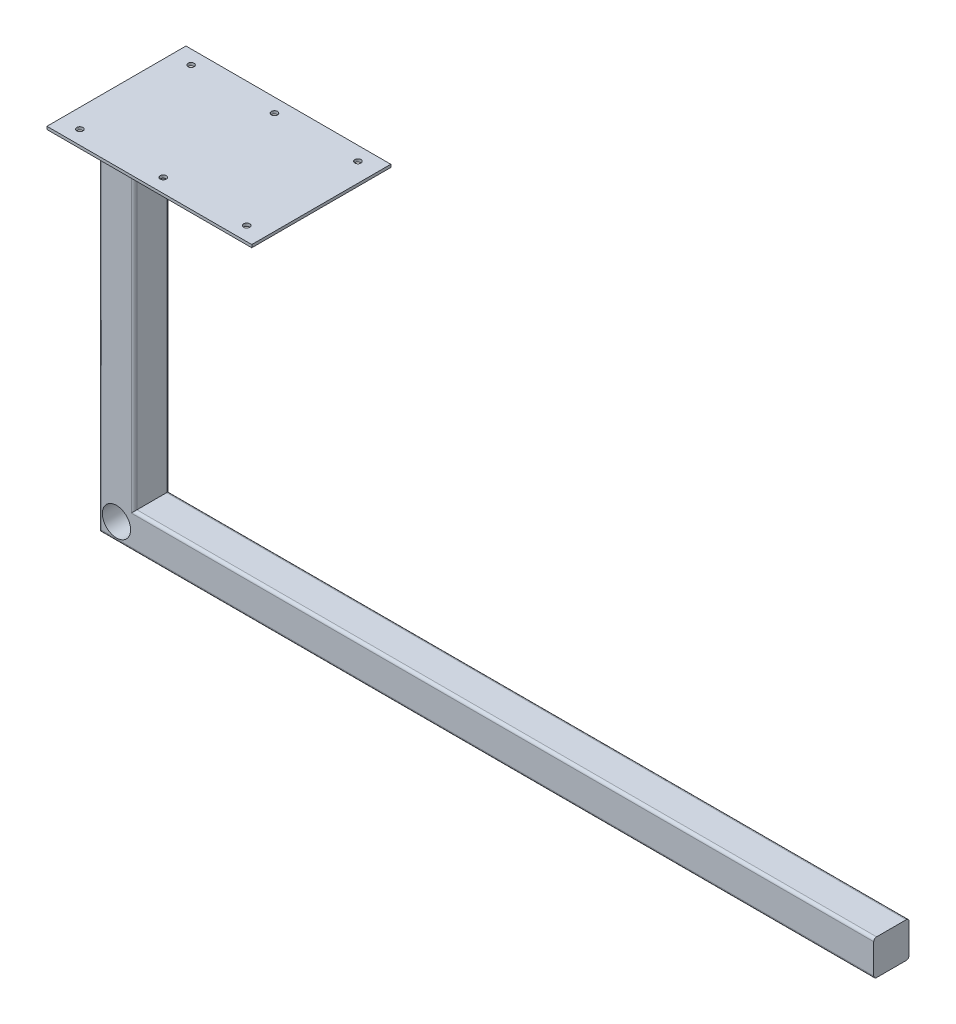
ISO-10303-21;
HEADER;
FILE_DESCRIPTION(('STEP AP214'),'2;1');
FILE_NAME('part.step','',(''),(''),'','','');
FILE_SCHEMA(('AUTOMOTIVE_DESIGN { 1 0 10303 214 1 1 1 1 }'));
ENDSEC;
DATA;
#1=APPLICATION_CONTEXT('core data for automotive mechanical design processes');
#2=APPLICATION_PROTOCOL_DEFINITION('international standard','automotive_design',2000,#1);
#3=PRODUCT_CONTEXT('',#1,'mechanical');
#4=PRODUCT('Part','Part','',(#3));
#5=PRODUCT_RELATED_PRODUCT_CATEGORY('part','',(#4));
#6=PRODUCT_DEFINITION_FORMATION('','',#4);
#7=PRODUCT_DEFINITION_CONTEXT('part definition',#1,'design');
#8=PRODUCT_DEFINITION('design','',#6,#7);
#9=PRODUCT_DEFINITION_SHAPE('','',#8);
#10=(LENGTH_UNIT() NAMED_UNIT(*) SI_UNIT(.MILLI.,.METRE.));
#11=(NAMED_UNIT(*) PLANE_ANGLE_UNIT() SI_UNIT($,.RADIAN.));
#12=(NAMED_UNIT(*) SI_UNIT($,.STERADIAN.) SOLID_ANGLE_UNIT());
#13=UNCERTAINTY_MEASURE_WITH_UNIT(LENGTH_MEASURE(1.E-05),#10,'distance_accuracy_value','');
#14=(GEOMETRIC_REPRESENTATION_CONTEXT(3) GLOBAL_UNCERTAINTY_ASSIGNED_CONTEXT((#13)) GLOBAL_UNIT_ASSIGNED_CONTEXT((#10,
#11,#12)) REPRESENTATION_CONTEXT('',''));
#15=CARTESIAN_POINT('',(0.,0.,0.));
#16=DIRECTION('',(0.,0.,1.));
#17=DIRECTION('',(1.,0.,0.));
#18=AXIS2_PLACEMENT_3D('',#15,#16,#17);
#19=CARTESIAN_POINT('',(0.,0.,31.75));
#20=DIRECTION('',(0.,0.,1.));
#21=DIRECTION('',(1.,0.,0.));
#22=AXIS2_PLACEMENT_3D('',#19,#20,#21);
#23=PLANE('',#22);
#24=DIRECTION('',(0.,-1.,0.));
#25=VECTOR('',#24,1.);
#26=CARTESIAN_POINT('',(2.54,0.,31.75));
#27=LINE('',#26,#25);
#28=CARTESIAN_POINT('',(2.54,336.55,31.75));
#29=VERTEX_POINT('',#28);
#30=CARTESIAN_POINT('',(2.54,2.54,31.75));
#31=VERTEX_POINT('',#30);
#32=EDGE_CURVE('E261',#29,#31,#27,.T.);
#33=ORIENTED_EDGE('',*,*,#32,.T.);
#34=DIRECTION('',(1.,0.,0.));
#35=VECTOR('',#34,1.);
#36=CARTESIAN_POINT('',(696.722,2.54,31.75));
#37=LINE('',#36,#35);
#38=CARTESIAN_POINT('',(696.722,2.54,31.75));
#39=VERTEX_POINT('',#38);
#40=EDGE_CURVE('E263',#31,#39,#37,.T.);
#41=ORIENTED_EDGE('',*,*,#40,.T.);
#42=DIRECTION('',(0.,-1.,0.));
#43=VECTOR('',#42,1.);
#44=CARTESIAN_POINT('',(696.722,31.75,31.75));
#45=LINE('',#44,#43);
#46=CARTESIAN_POINT('',(696.722,29.21,31.75));
#47=VERTEX_POINT('',#46);
#48=EDGE_CURVE('E215',#47,#39,#45,.T.);
#49=ORIENTED_EDGE('',*,*,#48,.F.);
#50=DIRECTION('',(1.,0.,0.));
#51=VECTOR('',#50,1.);
#52=CARTESIAN_POINT('',(0.,29.21,31.75));
#53=LINE('',#52,#51);
#54=CARTESIAN_POINT('',(29.21,29.21,31.75));
#55=VERTEX_POINT('',#54);
#56=EDGE_CURVE('E259',#47,#55,#53,.F.);
#57=ORIENTED_EDGE('',*,*,#56,.T.);
#58=DIRECTION('',(0.,-1.,0.));
#59=VECTOR('',#58,1.);
#60=CARTESIAN_POINT('',(29.21,0.,31.75));
#61=LINE('',#60,#59);
#62=CARTESIAN_POINT('',(29.21,336.55,31.75));
#63=VERTEX_POINT('',#62);
#64=EDGE_CURVE('E257',#55,#63,#61,.F.);
#65=ORIENTED_EDGE('',*,*,#64,.T.);
#66=DIRECTION('',(-1.,0.,0.));
#67=VECTOR('',#66,1.);
#68=CARTESIAN_POINT('',(31.75,336.55,31.75));
#69=LINE('',#68,#67);
#70=EDGE_CURVE('E213',#63,#29,#69,.T.);
#71=ORIENTED_EDGE('',*,*,#70,.T.);
#72=EDGE_LOOP('',(#33,#41,#49,#57,#65,#71));
#73=FACE_BOUND('',#72,.T.);
#74=CARTESIAN_POINT('',(15.8750000000001,15.875,31.75));
#75=DIRECTION('',(0.,0.,1.));
#76=DIRECTION('',(1.,0.,0.));
#77=AXIS2_PLACEMENT_3D('',#74,#75,#76);
#78=CIRCLE('',#77,12.7);
#79=CARTESIAN_POINT('',(28.5750000000001,15.875,31.75));
#80=VERTEX_POINT('',#79);
#81=EDGE_CURVE('E205',#80,#80,#78,.T.);
#82=ORIENTED_EDGE('',*,*,#81,.F.);
#83=EDGE_LOOP('',(#82));
#84=FACE_BOUND('',#83,.T.);
#85=ADVANCED_FACE('F60',(#73,#84),#23,.T.);
#86=CARTESIAN_POINT('',(0.,0.,0.));
#87=DIRECTION('',(0.,0.,1.));
#88=DIRECTION('',(1.,0.,0.));
#89=AXIS2_PLACEMENT_3D('',#86,#87,#88);
#90=PLANE('',#89);
#91=DIRECTION('',(0.,-1.,0.));
#92=VECTOR('',#91,1.);
#93=CARTESIAN_POINT('',(696.722,31.75,0.));
#94=LINE('',#93,#92);
#95=CARTESIAN_POINT('',(696.722,29.21,0.));
#96=VERTEX_POINT('',#95);
#97=CARTESIAN_POINT('',(696.722,2.54,0.));
#98=VERTEX_POINT('',#97);
#99=EDGE_CURVE('E216',#96,#98,#94,.T.);
#100=ORIENTED_EDGE('',*,*,#99,.T.);
#101=DIRECTION('',(1.,0.,0.));
#102=VECTOR('',#101,1.);
#103=CARTESIAN_POINT('',(0.,2.54,0.));
#104=LINE('',#103,#102);
#105=CARTESIAN_POINT('',(2.54,2.54,0.));
#106=VERTEX_POINT('',#105);
#107=EDGE_CURVE('E255',#98,#106,#104,.F.);
#108=ORIENTED_EDGE('',*,*,#107,.T.);
#109=DIRECTION('',(0.,-1.,0.));
#110=VECTOR('',#109,1.);
#111=CARTESIAN_POINT('',(2.54,0.,0.));
#112=LINE('',#111,#110);
#113=CARTESIAN_POINT('',(2.54,336.55,0.));
#114=VERTEX_POINT('',#113);
#115=EDGE_CURVE('E253',#106,#114,#112,.F.);
#116=ORIENTED_EDGE('',*,*,#115,.T.);
#117=DIRECTION('',(-1.,0.,0.));
#118=VECTOR('',#117,1.);
#119=CARTESIAN_POINT('',(31.75,336.55,0.));
#120=LINE('',#119,#118);
#121=CARTESIAN_POINT('',(29.21,336.55,0.));
#122=VERTEX_POINT('',#121);
#123=EDGE_CURVE('E208',#122,#114,#120,.T.);
#124=ORIENTED_EDGE('',*,*,#123,.F.);
#125=DIRECTION('',(0.,-1.,0.));
#126=VECTOR('',#125,1.);
#127=CARTESIAN_POINT('',(29.21,31.75,0.));
#128=LINE('',#127,#126);
#129=CARTESIAN_POINT('',(29.21,29.21,0.));
#130=VERTEX_POINT('',#129);
#131=EDGE_CURVE('E248',#122,#130,#128,.T.);
#132=ORIENTED_EDGE('',*,*,#131,.T.);
#133=DIRECTION('',(1.,0.,0.));
#134=VECTOR('',#133,1.);
#135=CARTESIAN_POINT('',(696.722,29.21,0.));
#136=LINE('',#135,#134);
#137=EDGE_CURVE('E250',#130,#96,#136,.T.);
#138=ORIENTED_EDGE('',*,*,#137,.T.);
#139=EDGE_LOOP('',(#100,#108,#116,#124,#132,#138));
#140=FACE_BOUND('',#139,.T.);
#141=CARTESIAN_POINT('',(15.8750000000001,15.875,0.));
#142=DIRECTION('',(0.,0.,1.));
#143=DIRECTION('',(1.,0.,0.));
#144=AXIS2_PLACEMENT_3D('',#141,#142,#143);
#145=CIRCLE('',#144,12.7);
#146=CARTESIAN_POINT('',(28.5750000000001,15.875,0.));
#147=VERTEX_POINT('',#146);
#148=EDGE_CURVE('E209',#147,#147,#145,.T.);
#149=ORIENTED_EDGE('',*,*,#148,.T.);
#150=EDGE_LOOP('',(#149));
#151=FACE_BOUND('',#150,.T.);
#152=ADVANCED_FACE('F324',(#140,#151),#90,.F.);
#153=CARTESIAN_POINT('',(0.,336.55,31.75));
#154=DIRECTION('',(1.,0.,0.));
#155=DIRECTION('',(0.,0.,-1.));
#156=AXIS2_PLACEMENT_3D('',#153,#154,#155);
#157=PLANE('',#156);
#158=DIRECTION('',(0.,-1.,0.));
#159=VECTOR('',#158,1.);
#160=CARTESIAN_POINT('',(0.,336.55,29.21));
#161=LINE('',#160,#159);
#162=CARTESIAN_POINT('',(0.,0.,29.21));
#163=VERTEX_POINT('',#162);
#164=CARTESIAN_POINT('',(0.,336.55,29.21));
#165=VERTEX_POINT('',#164);
#166=EDGE_CURVE('E271',#163,#165,#161,.F.);
#167=ORIENTED_EDGE('',*,*,#166,.T.);
#168=DIRECTION('',(0.,0.,1.));
#169=VECTOR('',#168,1.);
#170=CARTESIAN_POINT('',(0.,336.55,-46.625));
#171=LINE('',#170,#169);
#172=CARTESIAN_POINT('',(0.,336.55,78.375));
#173=VERTEX_POINT('',#172);
#174=EDGE_CURVE('E196',#165,#173,#171,.T.);
#175=ORIENTED_EDGE('',*,*,#174,.T.);
#176=DIRECTION('',(0.,-1.,0.));
#177=VECTOR('',#176,1.);
#178=CARTESIAN_POINT('',(0.,339.09,78.375));
#179=LINE('',#178,#177);
#180=CARTESIAN_POINT('',(0.,339.09,78.375));
#181=VERTEX_POINT('',#180);
#182=EDGE_CURVE('E177',#181,#173,#179,.T.);
#183=ORIENTED_EDGE('',*,*,#182,.F.);
#184=DIRECTION('',(0.,0.,1.));
#185=VECTOR('',#184,1.);
#186=CARTESIAN_POINT('',(0.,339.09,-46.625));
#187=LINE('',#186,#185);
#188=CARTESIAN_POINT('',(0.,339.09,-46.625));
#189=VERTEX_POINT('',#188);
#190=EDGE_CURVE('E183',#189,#181,#187,.T.);
#191=ORIENTED_EDGE('',*,*,#190,.F.);
#192=DIRECTION('',(0.,-1.,0.));
#193=VECTOR('',#192,1.);
#194=CARTESIAN_POINT('',(0.,339.09,-46.625));
#195=LINE('',#194,#193);
#196=CARTESIAN_POINT('',(0.,336.55,-46.625));
#197=VERTEX_POINT('',#196);
#198=EDGE_CURVE('E695',#189,#197,#195,.T.);
#199=ORIENTED_EDGE('',*,*,#198,.T.);
#200=CARTESIAN_POINT('',(0.,336.55,2.54));
#201=VERTEX_POINT('',#200);
#202=EDGE_CURVE('E696',#197,#201,#171,.T.);
#203=ORIENTED_EDGE('',*,*,#202,.T.);
#204=DIRECTION('',(0.,-1.,0.));
#205=VECTOR('',#204,1.);
#206=CARTESIAN_POINT('',(0.,336.55,2.54));
#207=LINE('',#206,#205);
#208=CARTESIAN_POINT('',(0.,0.,2.54));
#209=VERTEX_POINT('',#208);
#210=EDGE_CURVE('E273',#201,#209,#207,.T.);
#211=ORIENTED_EDGE('',*,*,#210,.T.);
#212=DIRECTION('',(0.,0.,-1.));
#213=VECTOR('',#212,1.);
#214=CARTESIAN_POINT('',(0.,0.,31.75));
#215=LINE('',#214,#213);
#216=EDGE_CURVE('E232',#163,#209,#215,.T.);
#217=ORIENTED_EDGE('',*,*,#216,.F.);
#218=EDGE_LOOP('',(#167,#175,#183,#191,#199,#203,#211,#217));
#219=FACE_BOUND('',#218,.T.);
#220=ADVANCED_FACE('F194',(#219),#157,.F.);
#221=CARTESIAN_POINT('',(645.922,0.,31.75));
#222=DIRECTION('',(0.,1.,0.));
#223=DIRECTION('',(0.,0.,1.));
#224=AXIS2_PLACEMENT_3D('',#221,#222,#223);
#225=PLANE('',#224);
#226=ORIENTED_EDGE('',*,*,#216,.T.);
#227=DIRECTION('',(1.,0.,0.));
#228=VECTOR('',#227,1.);
#229=CARTESIAN_POINT('',(645.922,0.,2.54));
#230=LINE('',#229,#228);
#231=CARTESIAN_POINT('',(696.722,0.,2.54));
#232=VERTEX_POINT('',#231);
#233=EDGE_CURVE('E237',#209,#232,#230,.T.);
#234=ORIENTED_EDGE('',*,*,#233,.T.);
#235=DIRECTION('',(0.,0.,-1.));
#236=VECTOR('',#235,1.);
#237=CARTESIAN_POINT('',(696.722,0.,31.75));
#238=LINE('',#237,#236);
#239=CARTESIAN_POINT('',(696.722,0.,29.21));
#240=VERTEX_POINT('',#239);
#241=EDGE_CURVE('E229',#240,#232,#238,.T.);
#242=ORIENTED_EDGE('',*,*,#241,.F.);
#243=DIRECTION('',(1.,0.,0.));
#244=VECTOR('',#243,1.);
#245=CARTESIAN_POINT('',(0.,0.,29.21));
#246=LINE('',#245,#244);
#247=EDGE_CURVE('E235',#240,#163,#246,.F.);
#248=ORIENTED_EDGE('',*,*,#247,.T.);
#249=EDGE_LOOP('',(#226,#234,#242,#248));
#250=FACE_BOUND('',#249,.T.);
#251=ADVANCED_FACE('F332',(#250),#225,.F.);
#252=CARTESIAN_POINT('',(696.722,31.75,31.75));
#253=DIRECTION('',(1.,0.,0.));
#254=DIRECTION('',(0.,0.,-1.));
#255=AXIS2_PLACEMENT_3D('',#252,#253,#254);
#256=PLANE('',#255);
#257=ORIENTED_EDGE('',*,*,#241,.T.);
#258=CARTESIAN_POINT('',(696.722,2.54,2.54));
#259=DIRECTION('',(1.,0.,0.));
#260=DIRECTION('',(0.,0.,-1.));
#261=AXIS2_PLACEMENT_3D('',#258,#259,#260);
#262=CIRCLE('',#261,2.54);
#263=EDGE_CURVE('E246',#232,#98,#262,.T.);
#264=ORIENTED_EDGE('',*,*,#263,.T.);
#265=ORIENTED_EDGE('',*,*,#99,.F.);
#266=CARTESIAN_POINT('',(696.722,29.21,2.54));
#267=DIRECTION('',(1.,0.,0.));
#268=DIRECTION('',(0.,0.,-1.));
#269=AXIS2_PLACEMENT_3D('',#266,#267,#268);
#270=CIRCLE('',#269,2.54);
#271=CARTESIAN_POINT('',(696.722,31.75,2.54));
#272=VERTEX_POINT('',#271);
#273=EDGE_CURVE('E240',#96,#272,#270,.T.);
#274=ORIENTED_EDGE('',*,*,#273,.T.);
#275=DIRECTION('',(0.,0.,-1.));
#276=VECTOR('',#275,1.);
#277=CARTESIAN_POINT('',(696.722,31.75,31.75));
#278=LINE('',#277,#276);
#279=CARTESIAN_POINT('',(696.722,31.75,29.21));
#280=VERTEX_POINT('',#279);
#281=EDGE_CURVE('E226',#280,#272,#278,.T.);
#282=ORIENTED_EDGE('',*,*,#281,.F.);
#283=CARTESIAN_POINT('',(696.722,29.21,29.21));
#284=DIRECTION('',(1.,0.,0.));
#285=DIRECTION('',(0.,0.,-1.));
#286=AXIS2_PLACEMENT_3D('',#283,#284,#285);
#287=CIRCLE('',#286,2.54);
#288=EDGE_CURVE('E242',#280,#47,#287,.T.);
#289=ORIENTED_EDGE('',*,*,#288,.T.);
#290=ORIENTED_EDGE('',*,*,#48,.T.);
#291=CARTESIAN_POINT('',(696.722,2.54,29.21));
#292=DIRECTION('',(1.,0.,0.));
#293=DIRECTION('',(0.,0.,-1.));
#294=AXIS2_PLACEMENT_3D('',#291,#292,#293);
#295=CIRCLE('',#294,2.54);
#296=EDGE_CURVE('E244',#39,#240,#295,.T.);
#297=ORIENTED_EDGE('',*,*,#296,.T.);
#298=EDGE_LOOP('',(#257,#264,#265,#274,#282,#289,#290,#297));
#299=FACE_BOUND('',#298,.T.);
#300=ADVANCED_FACE('F309',(#299),#256,.T.);
#301=CARTESIAN_POINT('',(31.75,31.75,31.75));
#302=DIRECTION('',(0.,1.,0.));
#303=DIRECTION('',(0.,0.,1.));
#304=AXIS2_PLACEMENT_3D('',#301,#302,#303);
#305=PLANE('',#304);
#306=DIRECTION('',(0.,0.,-1.));
#307=VECTOR('',#306,1.);
#308=CARTESIAN_POINT('',(31.75,31.75,31.75));
#309=LINE('',#308,#307);
#310=CARTESIAN_POINT('',(31.75,31.75,29.21));
#311=VERTEX_POINT('',#310);
#312=CARTESIAN_POINT('',(31.75,31.75,2.54));
#313=VERTEX_POINT('',#312);
#314=EDGE_CURVE('E224',#311,#313,#309,.T.);
#315=ORIENTED_EDGE('',*,*,#314,.F.);
#316=DIRECTION('',(1.,0.,0.));
#317=VECTOR('',#316,1.);
#318=CARTESIAN_POINT('',(31.75,31.75,29.21));
#319=LINE('',#318,#317);
#320=EDGE_CURVE('E268',#311,#280,#319,.T.);
#321=ORIENTED_EDGE('',*,*,#320,.T.);
#322=ORIENTED_EDGE('',*,*,#281,.T.);
#323=DIRECTION('',(1.,0.,0.));
#324=VECTOR('',#323,1.);
#325=CARTESIAN_POINT('',(31.75,31.75,2.54));
#326=LINE('',#325,#324);
#327=EDGE_CURVE('E266',#272,#313,#326,.F.);
#328=ORIENTED_EDGE('',*,*,#327,.T.);
#329=EDGE_LOOP('',(#315,#321,#322,#328));
#330=FACE_BOUND('',#329,.T.);
#331=ADVANCED_FACE('F314',(#330),#305,.T.);
#332=CARTESIAN_POINT('',(31.75,336.55,31.75));
#333=DIRECTION('',(1.,0.,0.));
#334=DIRECTION('',(0.,0.,-1.));
#335=AXIS2_PLACEMENT_3D('',#332,#333,#334);
#336=PLANE('',#335);
#337=ORIENTED_EDGE('',*,*,#314,.T.);
#338=DIRECTION('',(0.,-1.,0.));
#339=VECTOR('',#338,1.);
#340=CARTESIAN_POINT('',(31.75,336.55,2.54));
#341=LINE('',#340,#339);
#342=CARTESIAN_POINT('',(31.75,336.55,2.54));
#343=VERTEX_POINT('',#342);
#344=EDGE_CURVE('E12',#313,#343,#341,.F.);
#345=ORIENTED_EDGE('',*,*,#344,.T.);
#346=DIRECTION('',(0.,0.,-1.));
#347=VECTOR('',#346,1.);
#348=CARTESIAN_POINT('',(31.75,336.55,31.75));
#349=LINE('',#348,#347);
#350=CARTESIAN_POINT('',(31.75,336.55,29.21));
#351=VERTEX_POINT('',#350);
#352=EDGE_CURVE('E80',#351,#343,#349,.T.);
#353=ORIENTED_EDGE('',*,*,#352,.F.);
#354=DIRECTION('',(0.,-1.,0.));
#355=VECTOR('',#354,1.);
#356=CARTESIAN_POINT('',(31.75,336.55,29.21));
#357=LINE('',#356,#355);
#358=EDGE_CURVE('E69',#351,#311,#357,.T.);
#359=ORIENTED_EDGE('',*,*,#358,.T.);
#360=EDGE_LOOP('',(#337,#345,#353,#359));
#361=FACE_BOUND('',#360,.T.);
#362=ADVANCED_FACE('F316',(#361),#336,.T.);
#363=CARTESIAN_POINT('',(15.8750000000001,15.875,31.75));
#364=DIRECTION('',(0.,0.,-1.));
#365=DIRECTION('',(-1.,0.,0.));
#366=AXIS2_PLACEMENT_3D('',#363,#364,#365);
#367=CYLINDRICAL_SURFACE('',#366,12.7);
#368=ORIENTED_EDGE('',*,*,#81,.T.);
#369=EDGE_LOOP('',(#368));
#370=FACE_BOUND('',#369,.T.);
#371=ORIENTED_EDGE('',*,*,#148,.F.);
#372=EDGE_LOOP('',(#371));
#373=FACE_BOUND('',#372,.T.);
#374=ADVANCED_FACE('F365',(#370,#373),#367,.F.);
#375=CARTESIAN_POINT('',(2.54,336.55,2.54));
#376=DIRECTION('',(0.,-1.,0.));
#377=DIRECTION('',(0.,0.,-1.));
#378=AXIS2_PLACEMENT_3D('',#375,#376,#377);
#379=CYLINDRICAL_SURFACE('',#378,2.54);
#380=CARTESIAN_POINT('',(2.54,336.55,2.54));
#381=DIRECTION('',(0.,-1.,0.));
#382=DIRECTION('',(0.,0.,-1.));
#383=AXIS2_PLACEMENT_3D('',#380,#381,#382);
#384=CIRCLE('',#383,2.54);
#385=EDGE_CURVE('E284',#114,#201,#384,.F.);
#386=ORIENTED_EDGE('',*,*,#385,.F.);
#387=ORIENTED_EDGE('',*,*,#115,.F.);
#388=CARTESIAN_POINT('',(2.53999999999999,2.53999999999999,2.54));
#389=DIRECTION('',(0.707106781186547,-0.707106781186547,0.));
#390=DIRECTION('',(-0.707106781186547,-0.707106781186547,0.));
#391=AXIS2_PLACEMENT_3D('',#388,#389,#390);
#392=ELLIPSE('',#391,3.59210244842766,2.54);
#393=EDGE_CURVE('E212',#209,#106,#392,.T.);
#394=ORIENTED_EDGE('',*,*,#393,.F.);
#395=ORIENTED_EDGE('',*,*,#210,.F.);
#396=EDGE_LOOP('',(#386,#387,#394,#395));
#397=FACE_BOUND('',#396,.T.);
#398=ADVANCED_FACE('F340',(#397),#379,.T.);
#399=CARTESIAN_POINT('',(645.922,2.54,2.54));
#400=DIRECTION('',(1.,0.,0.));
#401=DIRECTION('',(0.,0.,-1.));
#402=AXIS2_PLACEMENT_3D('',#399,#400,#401);
#403=CYLINDRICAL_SURFACE('',#402,2.54);
#404=ORIENTED_EDGE('',*,*,#393,.T.);
#405=ORIENTED_EDGE('',*,*,#107,.F.);
#406=ORIENTED_EDGE('',*,*,#263,.F.);
#407=ORIENTED_EDGE('',*,*,#233,.F.);
#408=EDGE_LOOP('',(#404,#405,#406,#407));
#409=FACE_BOUND('',#408,.T.);
#410=ADVANCED_FACE('F330',(#409),#403,.T.);
#411=CARTESIAN_POINT('',(2.54,0.,29.21));
#412=DIRECTION('',(0.,1.,0.));
#413=DIRECTION('',(0.,0.,1.));
#414=AXIS2_PLACEMENT_3D('',#411,#412,#413);
#415=CYLINDRICAL_SURFACE('',#414,2.54);
#416=CARTESIAN_POINT('',(2.54,336.55,29.21));
#417=DIRECTION('',(0.,-1.,0.));
#418=DIRECTION('',(0.,0.,-1.));
#419=AXIS2_PLACEMENT_3D('',#416,#417,#418);
#420=CIRCLE('',#419,2.54);
#421=EDGE_CURVE('E278',#165,#29,#420,.F.);
#422=ORIENTED_EDGE('',*,*,#421,.F.);
#423=ORIENTED_EDGE('',*,*,#166,.F.);
#424=CARTESIAN_POINT('',(2.54,2.54,29.21));
#425=DIRECTION('',(-0.707106781186547,0.707106781186547,0.));
#426=DIRECTION('',(0.707106781186547,0.707106781186547,0.));
#427=AXIS2_PLACEMENT_3D('',#424,#425,#426);
#428=ELLIPSE('',#427,3.59210244842766,2.54);
#429=EDGE_CURVE('E290',#31,#163,#428,.F.);
#430=ORIENTED_EDGE('',*,*,#429,.F.);
#431=ORIENTED_EDGE('',*,*,#32,.F.);
#432=EDGE_LOOP('',(#422,#423,#430,#431));
#433=FACE_BOUND('',#432,.T.);
#434=ADVANCED_FACE('F345',(#433),#415,.T.);
#435=CARTESIAN_POINT('',(0.,2.54,29.21));
#436=DIRECTION('',(-1.,0.,0.));
#437=DIRECTION('',(0.,0.,1.));
#438=AXIS2_PLACEMENT_3D('',#435,#436,#437);
#439=CYLINDRICAL_SURFACE('',#438,2.54);
#440=ORIENTED_EDGE('',*,*,#429,.T.);
#441=ORIENTED_EDGE('',*,*,#247,.F.);
#442=ORIENTED_EDGE('',*,*,#296,.F.);
#443=ORIENTED_EDGE('',*,*,#40,.F.);
#444=EDGE_LOOP('',(#440,#441,#442,#443));
#445=FACE_BOUND('',#444,.T.);
#446=ADVANCED_FACE('F348',(#445),#439,.T.);
#447=CARTESIAN_POINT('',(29.21,336.55,29.21));
#448=DIRECTION('',(0.,-1.,0.));
#449=DIRECTION('',(0.,0.,-1.));
#450=AXIS2_PLACEMENT_3D('',#447,#448,#449);
#451=CYLINDRICAL_SURFACE('',#450,2.54);
#452=CARTESIAN_POINT('',(29.21,336.55,29.21));
#453=DIRECTION('',(0.,-1.,0.));
#454=DIRECTION('',(0.,0.,-1.));
#455=AXIS2_PLACEMENT_3D('',#452,#453,#454);
#456=CIRCLE('',#455,2.54);
#457=EDGE_CURVE('E275',#63,#351,#456,.F.);
#458=ORIENTED_EDGE('',*,*,#457,.F.);
#459=ORIENTED_EDGE('',*,*,#64,.F.);
#460=CARTESIAN_POINT('',(29.21,29.21,29.21));
#461=DIRECTION('',(0.707106781186547,-0.707106781186547,0.));
#462=DIRECTION('',(0.707106781186547,0.707106781186547,0.));
#463=AXIS2_PLACEMENT_3D('',#460,#461,#462);
#464=ELLIPSE('',#463,3.59210244842766,2.54);
#465=EDGE_CURVE('E200',#311,#55,#464,.T.);
#466=ORIENTED_EDGE('',*,*,#465,.F.);
#467=ORIENTED_EDGE('',*,*,#358,.F.);
#468=EDGE_LOOP('',(#458,#459,#466,#467));
#469=FACE_BOUND('',#468,.T.);
#470=ADVANCED_FACE('F301',(#469),#451,.T.);
#471=CARTESIAN_POINT('',(31.75,29.21,29.21));
#472=DIRECTION('',(1.,0.,0.));
#473=DIRECTION('',(0.,0.,-1.));
#474=AXIS2_PLACEMENT_3D('',#471,#472,#473);
#475=CYLINDRICAL_SURFACE('',#474,2.54);
#476=ORIENTED_EDGE('',*,*,#465,.T.);
#477=ORIENTED_EDGE('',*,*,#56,.F.);
#478=ORIENTED_EDGE('',*,*,#288,.F.);
#479=ORIENTED_EDGE('',*,*,#320,.F.);
#480=EDGE_LOOP('',(#476,#477,#478,#479));
#481=FACE_BOUND('',#480,.T.);
#482=ADVANCED_FACE('F297',(#481),#475,.T.);
#483=CARTESIAN_POINT('',(29.21,0.,2.54));
#484=DIRECTION('',(0.,1.,0.));
#485=DIRECTION('',(0.,0.,1.));
#486=AXIS2_PLACEMENT_3D('',#483,#484,#485);
#487=CYLINDRICAL_SURFACE('',#486,2.54);
#488=CARTESIAN_POINT('',(29.21,336.55,2.54));
#489=DIRECTION('',(0.,-1.,0.));
#490=DIRECTION('',(0.,0.,-1.));
#491=AXIS2_PLACEMENT_3D('',#488,#489,#490);
#492=CIRCLE('',#491,2.54);
#493=EDGE_CURVE('E281',#343,#122,#492,.F.);
#494=ORIENTED_EDGE('',*,*,#493,.F.);
#495=ORIENTED_EDGE('',*,*,#344,.F.);
#496=CARTESIAN_POINT('',(29.21,29.21,2.54));
#497=DIRECTION('',(-0.707106781186547,0.707106781186547,0.));
#498=DIRECTION('',(-0.707106781186547,-0.707106781186547,0.));
#499=AXIS2_PLACEMENT_3D('',#496,#497,#498);
#500=ELLIPSE('',#499,3.59210244842766,2.54);
#501=EDGE_CURVE('E64',#130,#313,#500,.F.);
#502=ORIENTED_EDGE('',*,*,#501,.F.);
#503=ORIENTED_EDGE('',*,*,#131,.F.);
#504=EDGE_LOOP('',(#494,#495,#502,#503));
#505=FACE_BOUND('',#504,.T.);
#506=ADVANCED_FACE('F62',(#505),#487,.T.);
#507=CARTESIAN_POINT('',(0.,29.21,2.54));
#508=DIRECTION('',(-1.,0.,0.));
#509=DIRECTION('',(0.,0.,1.));
#510=AXIS2_PLACEMENT_3D('',#507,#508,#509);
#511=CYLINDRICAL_SURFACE('',#510,2.54);
#512=ORIENTED_EDGE('',*,*,#501,.T.);
#513=ORIENTED_EDGE('',*,*,#327,.F.);
#514=ORIENTED_EDGE('',*,*,#273,.F.);
#515=ORIENTED_EDGE('',*,*,#137,.F.);
#516=EDGE_LOOP('',(#512,#513,#514,#515));
#517=FACE_BOUND('',#516,.T.);
#518=ADVANCED_FACE('F321',(#517),#511,.T.);
#519=CARTESIAN_POINT('',(0.,339.09,78.375));
#520=DIRECTION('',(0.,0.,-1.));
#521=DIRECTION('',(-1.,0.,0.));
#522=AXIS2_PLACEMENT_3D('',#519,#520,#521);
#523=PLANE('',#522);
#524=DIRECTION('',(1.,0.,0.));
#525=VECTOR('',#524,1.);
#526=CARTESIAN_POINT('',(0.,336.55,78.375));
#527=LINE('',#526,#525);
#528=CARTESIAN_POINT('',(184.15,336.55,78.375));
#529=VERTEX_POINT('',#528);
#530=EDGE_CURVE('E699',#173,#529,#527,.T.);
#531=ORIENTED_EDGE('',*,*,#530,.T.);
#532=DIRECTION('',(0.,-1.,0.));
#533=VECTOR('',#532,1.);
#534=CARTESIAN_POINT('',(184.15,339.09,78.375));
#535=LINE('',#534,#533);
#536=CARTESIAN_POINT('',(184.15,339.09,78.375));
#537=VERTEX_POINT('',#536);
#538=EDGE_CURVE('E179',#537,#529,#535,.T.);
#539=ORIENTED_EDGE('',*,*,#538,.F.);
#540=DIRECTION('',(1.,0.,0.));
#541=VECTOR('',#540,1.);
#542=CARTESIAN_POINT('',(0.,339.09,78.375));
#543=LINE('',#542,#541);
#544=EDGE_CURVE('E173',#181,#537,#543,.T.);
#545=ORIENTED_EDGE('',*,*,#544,.F.);
#546=ORIENTED_EDGE('',*,*,#182,.T.);
#547=EDGE_LOOP('',(#531,#539,#545,#546));
#548=FACE_BOUND('',#547,.T.);
#549=ADVANCED_FACE('F175',(#548),#523,.F.);
#550=CARTESIAN_POINT('',(184.15,339.09,-46.625));
#551=DIRECTION('',(-1.,0.,0.));
#552=DIRECTION('',(0.,0.,1.));
#553=AXIS2_PLACEMENT_3D('',#550,#551,#552);
#554=PLANE('',#553);
#555=DIRECTION('',(0.,0.,-1.));
#556=VECTOR('',#555,1.);
#557=CARTESIAN_POINT('',(184.15,336.55,-46.625));
#558=LINE('',#557,#556);
#559=CARTESIAN_POINT('',(184.15,336.55,-46.625));
#560=VERTEX_POINT('',#559);
#561=EDGE_CURVE('E701',#529,#560,#558,.T.);
#562=ORIENTED_EDGE('',*,*,#561,.T.);
#563=DIRECTION('',(0.,-1.,0.));
#564=VECTOR('',#563,1.);
#565=CARTESIAN_POINT('',(184.15,339.09,-46.625));
#566=LINE('',#565,#564);
#567=CARTESIAN_POINT('',(184.15,339.09,-46.625));
#568=VERTEX_POINT('',#567);
#569=EDGE_CURVE('E201',#568,#560,#566,.T.);
#570=ORIENTED_EDGE('',*,*,#569,.F.);
#571=DIRECTION('',(0.,0.,-1.));
#572=VECTOR('',#571,1.);
#573=CARTESIAN_POINT('',(184.15,339.09,-46.625));
#574=LINE('',#573,#572);
#575=EDGE_CURVE('E182',#537,#568,#574,.T.);
#576=ORIENTED_EDGE('',*,*,#575,.F.);
#577=ORIENTED_EDGE('',*,*,#538,.T.);
#578=EDGE_LOOP('',(#562,#570,#576,#577));
#579=FACE_BOUND('',#578,.T.);
#580=ADVANCED_FACE('F475',(#579),#554,.F.);
#581=CARTESIAN_POINT('',(0.,339.09,-46.625));
#582=DIRECTION('',(0.,0.,1.));
#583=DIRECTION('',(1.,0.,0.));
#584=AXIS2_PLACEMENT_3D('',#581,#582,#583);
#585=PLANE('',#584);
#586=DIRECTION('',(-1.,0.,0.));
#587=VECTOR('',#586,1.);
#588=CARTESIAN_POINT('',(0.,336.55,-46.625));
#589=LINE('',#588,#587);
#590=EDGE_CURVE('E192',#560,#197,#589,.T.);
#591=ORIENTED_EDGE('',*,*,#590,.T.);
#592=ORIENTED_EDGE('',*,*,#198,.F.);
#593=DIRECTION('',(-1.,0.,0.));
#594=VECTOR('',#593,1.);
#595=CARTESIAN_POINT('',(0.,339.09,-46.625));
#596=LINE('',#595,#594);
#597=EDGE_CURVE('E188',#568,#189,#596,.T.);
#598=ORIENTED_EDGE('',*,*,#597,.F.);
#599=ORIENTED_EDGE('',*,*,#569,.T.);
#600=EDGE_LOOP('',(#591,#592,#598,#599));
#601=FACE_BOUND('',#600,.T.);
#602=ADVANCED_FACE('F483',(#601),#585,.F.);
#603=CARTESIAN_POINT('',(0.,339.09,0.));
#604=DIRECTION('',(0.,1.,0.));
#605=DIRECTION('',(0.,0.,1.));
#606=AXIS2_PLACEMENT_3D('',#603,#604,#605);
#607=PLANE('',#606);
#608=CARTESIAN_POINT('',(167.075,339.09,-34.125));
#609=DIRECTION('',(0.,1.,0.));
#610=DIRECTION('',(0.,0.,1.));
#611=AXIS2_PLACEMENT_3D('',#608,#609,#610);
#612=CIRCLE('',#611,2.75);
#613=CARTESIAN_POINT('',(167.075,339.09,-31.375));
#614=VERTEX_POINT('',#613);
#615=EDGE_CURVE('E641',#614,#614,#612,.T.);
#616=ORIENTED_EDGE('',*,*,#615,.F.);
#617=EDGE_LOOP('',(#616));
#618=FACE_BOUND('',#617,.T.);
#619=CARTESIAN_POINT('',(17.075,339.09,65.875));
#620=DIRECTION('',(0.,1.,0.));
#621=DIRECTION('',(0.,0.,1.));
#622=AXIS2_PLACEMENT_3D('',#619,#620,#621);
#623=CIRCLE('',#622,2.75);
#624=CARTESIAN_POINT('',(17.075,339.09,68.625));
#625=VERTEX_POINT('',#624);
#626=EDGE_CURVE('E651',#625,#625,#623,.T.);
#627=ORIENTED_EDGE('',*,*,#626,.F.);
#628=EDGE_LOOP('',(#627));
#629=FACE_BOUND('',#628,.T.);
#630=CARTESIAN_POINT('',(17.075,339.09,-34.125));
#631=DIRECTION('',(0.,1.,0.));
#632=DIRECTION('',(0.,0.,1.));
#633=AXIS2_PLACEMENT_3D('',#630,#631,#632);
#634=CIRCLE('',#633,2.75);
#635=CARTESIAN_POINT('',(17.075,339.09,-31.375));
#636=VERTEX_POINT('',#635);
#637=EDGE_CURVE('E660',#636,#636,#634,.T.);
#638=ORIENTED_EDGE('',*,*,#637,.F.);
#639=EDGE_LOOP('',(#638));
#640=FACE_BOUND('',#639,.T.);
#641=CARTESIAN_POINT('',(167.075,339.09,65.875));
#642=DIRECTION('',(0.,1.,0.));
#643=DIRECTION('',(0.,0.,1.));
#644=AXIS2_PLACEMENT_3D('',#641,#642,#643);
#645=CIRCLE('',#644,2.75);
#646=CARTESIAN_POINT('',(167.075,339.09,68.625));
#647=VERTEX_POINT('',#646);
#648=EDGE_CURVE('E669',#647,#647,#645,.T.);
#649=ORIENTED_EDGE('',*,*,#648,.F.);
#650=EDGE_LOOP('',(#649));
#651=FACE_BOUND('',#650,.T.);
#652=CARTESIAN_POINT('',(92.075,339.09,-34.125));
#653=DIRECTION('',(0.,1.,0.));
#654=DIRECTION('',(0.,0.,1.));
#655=AXIS2_PLACEMENT_3D('',#652,#653,#654);
#656=CIRCLE('',#655,2.75);
#657=CARTESIAN_POINT('',(92.075,339.09,-31.375));
#658=VERTEX_POINT('',#657);
#659=EDGE_CURVE('E678',#658,#658,#656,.T.);
#660=ORIENTED_EDGE('',*,*,#659,.F.);
#661=EDGE_LOOP('',(#660));
#662=FACE_BOUND('',#661,.T.);
#663=CARTESIAN_POINT('',(92.075,339.09,65.875));
#664=DIRECTION('',(0.,1.,0.));
#665=DIRECTION('',(0.,0.,1.));
#666=AXIS2_PLACEMENT_3D('',#663,#664,#665);
#667=CIRCLE('',#666,2.75);
#668=CARTESIAN_POINT('',(92.075,339.09,68.625));
#669=VERTEX_POINT('',#668);
#670=EDGE_CURVE('E687',#669,#669,#667,.T.);
#671=ORIENTED_EDGE('',*,*,#670,.F.);
#672=EDGE_LOOP('',(#671));
#673=FACE_BOUND('',#672,.T.);
#674=ORIENTED_EDGE('',*,*,#190,.T.);
#675=ORIENTED_EDGE('',*,*,#544,.T.);
#676=ORIENTED_EDGE('',*,*,#575,.T.);
#677=ORIENTED_EDGE('',*,*,#597,.T.);
#678=EDGE_LOOP('',(#674,#675,#676,#677));
#679=FACE_BOUND('',#678,.T.);
#680=ADVANCED_FACE('F186',(#618,#629,#640,#651,#662,#673,#679),#607,.T.);
#681=CARTESIAN_POINT('',(0.,336.55,0.));
#682=DIRECTION('',(0.,1.,0.));
#683=DIRECTION('',(0.,0.,1.));
#684=AXIS2_PLACEMENT_3D('',#681,#682,#683);
#685=PLANE('',#684);
#686=CARTESIAN_POINT('',(167.075,336.55,-34.125));
#687=DIRECTION('',(0.,1.,0.));
#688=DIRECTION('',(0.,0.,1.));
#689=AXIS2_PLACEMENT_3D('',#686,#687,#688);
#690=CIRCLE('',#689,2.775);
#691=CARTESIAN_POINT('',(167.075,336.55,-31.35));
#692=VERTEX_POINT('',#691);
#693=EDGE_CURVE('E642',#692,#692,#690,.T.);
#694=ORIENTED_EDGE('',*,*,#693,.T.);
#695=EDGE_LOOP('',(#694));
#696=FACE_BOUND('',#695,.T.);
#697=CARTESIAN_POINT('',(17.075,336.55,65.875));
#698=DIRECTION('',(0.,1.,0.));
#699=DIRECTION('',(0.,0.,1.));
#700=AXIS2_PLACEMENT_3D('',#697,#698,#699);
#701=CIRCLE('',#700,2.775);
#702=CARTESIAN_POINT('',(17.075,336.55,68.65));
#703=VERTEX_POINT('',#702);
#704=EDGE_CURVE('E644',#703,#703,#701,.T.);
#705=ORIENTED_EDGE('',*,*,#704,.T.);
#706=EDGE_LOOP('',(#705));
#707=FACE_BOUND('',#706,.T.);
#708=CARTESIAN_POINT('',(17.075,336.55,-34.125));
#709=DIRECTION('',(0.,1.,0.));
#710=DIRECTION('',(0.,0.,1.));
#711=AXIS2_PLACEMENT_3D('',#708,#709,#710);
#712=CIRCLE('',#711,2.775);
#713=CARTESIAN_POINT('',(17.075,336.55,-31.35));
#714=VERTEX_POINT('',#713);
#715=EDGE_CURVE('E657',#714,#714,#712,.T.);
#716=ORIENTED_EDGE('',*,*,#715,.T.);
#717=EDGE_LOOP('',(#716));
#718=FACE_BOUND('',#717,.T.);
#719=CARTESIAN_POINT('',(167.075,336.55,65.875));
#720=DIRECTION('',(0.,1.,0.));
#721=DIRECTION('',(0.,0.,1.));
#722=AXIS2_PLACEMENT_3D('',#719,#720,#721);
#723=CIRCLE('',#722,2.775);
#724=CARTESIAN_POINT('',(167.075,336.55,68.65));
#725=VERTEX_POINT('',#724);
#726=EDGE_CURVE('E666',#725,#725,#723,.T.);
#727=ORIENTED_EDGE('',*,*,#726,.T.);
#728=EDGE_LOOP('',(#727));
#729=FACE_BOUND('',#728,.T.);
#730=CARTESIAN_POINT('',(92.075,336.55,-34.125));
#731=DIRECTION('',(0.,1.,0.));
#732=DIRECTION('',(0.,0.,1.));
#733=AXIS2_PLACEMENT_3D('',#730,#731,#732);
#734=CIRCLE('',#733,2.775);
#735=CARTESIAN_POINT('',(92.075,336.55,-31.35));
#736=VERTEX_POINT('',#735);
#737=EDGE_CURVE('E675',#736,#736,#734,.T.);
#738=ORIENTED_EDGE('',*,*,#737,.T.);
#739=EDGE_LOOP('',(#738));
#740=FACE_BOUND('',#739,.T.);
#741=CARTESIAN_POINT('',(92.075,336.55,65.875));
#742=DIRECTION('',(0.,1.,0.));
#743=DIRECTION('',(0.,0.,1.));
#744=AXIS2_PLACEMENT_3D('',#741,#742,#743);
#745=CIRCLE('',#744,2.775);
#746=CARTESIAN_POINT('',(92.075,336.55,68.65));
#747=VERTEX_POINT('',#746);
#748=EDGE_CURVE('E684',#747,#747,#745,.T.);
#749=ORIENTED_EDGE('',*,*,#748,.T.);
#750=EDGE_LOOP('',(#749));
#751=FACE_BOUND('',#750,.T.);
#752=ORIENTED_EDGE('',*,*,#123,.T.);
#753=ORIENTED_EDGE('',*,*,#385,.T.);
#754=ORIENTED_EDGE('',*,*,#202,.F.);
#755=ORIENTED_EDGE('',*,*,#590,.F.);
#756=ORIENTED_EDGE('',*,*,#561,.F.);
#757=ORIENTED_EDGE('',*,*,#530,.F.);
#758=ORIENTED_EDGE('',*,*,#174,.F.);
#759=ORIENTED_EDGE('',*,*,#421,.T.);
#760=ORIENTED_EDGE('',*,*,#70,.F.);
#761=ORIENTED_EDGE('',*,*,#457,.T.);
#762=ORIENTED_EDGE('',*,*,#352,.T.);
#763=ORIENTED_EDGE('',*,*,#493,.T.);
#764=EDGE_LOOP('',(#752,#753,#754,#755,#756,#757,#758,#759,#760,#761,#762,#763));
#765=FACE_BOUND('',#764,.T.);
#766=ADVANCED_FACE('F342',(#696,#707,#718,#729,#740,#751,#765),#685,.F.);
#767=CARTESIAN_POINT('',(92.075,336.575,65.875));
#768=DIRECTION('',(0.,-1.,0.));
#769=DIRECTION('',(0.,0.,-1.));
#770=AXIS2_PLACEMENT_3D('',#767,#768,#769);
#771=CONICAL_SURFACE('',#770,2.75,0.785398163397448);
#772=ORIENTED_EDGE('',*,*,#748,.F.);
#773=EDGE_LOOP('',(#772));
#774=FACE_BOUND('',#773,.T.);
#775=CARTESIAN_POINT('',(92.075,336.575,65.875));
#776=DIRECTION('',(0.,1.,0.));
#777=DIRECTION('',(0.,0.,1.));
#778=AXIS2_PLACEMENT_3D('',#775,#776,#777);
#779=CIRCLE('',#778,2.75);
#780=CARTESIAN_POINT('',(92.075,336.575,68.625));
#781=VERTEX_POINT('',#780);
#782=EDGE_CURVE('E690',#781,#781,#779,.T.);
#783=ORIENTED_EDGE('',*,*,#782,.T.);
#784=EDGE_LOOP('',(#783));
#785=FACE_BOUND('',#784,.T.);
#786=ADVANCED_FACE('F511',(#774,#785),#771,.F.);
#787=CARTESIAN_POINT('',(92.075,339.09,65.875));
#788=DIRECTION('',(0.,1.,0.));
#789=DIRECTION('',(0.,0.,1.));
#790=AXIS2_PLACEMENT_3D('',#787,#788,#789);
#791=CYLINDRICAL_SURFACE('',#790,2.75);
#792=ORIENTED_EDGE('',*,*,#782,.F.);
#793=EDGE_LOOP('',(#792));
#794=FACE_BOUND('',#793,.T.);
#795=ORIENTED_EDGE('',*,*,#670,.T.);
#796=EDGE_LOOP('',(#795));
#797=FACE_BOUND('',#796,.T.);
#798=ADVANCED_FACE('F521',(#794,#797),#791,.F.);
#799=CARTESIAN_POINT('',(92.075,336.575,-34.125));
#800=DIRECTION('',(0.,-1.,0.));
#801=DIRECTION('',(0.,0.,-1.));
#802=AXIS2_PLACEMENT_3D('',#799,#800,#801);
#803=CONICAL_SURFACE('',#802,2.75,0.785398163397448);
#804=ORIENTED_EDGE('',*,*,#737,.F.);
#805=EDGE_LOOP('',(#804));
#806=FACE_BOUND('',#805,.T.);
#807=CARTESIAN_POINT('',(92.075,336.575,-34.125));
#808=DIRECTION('',(0.,1.,0.));
#809=DIRECTION('',(0.,0.,1.));
#810=AXIS2_PLACEMENT_3D('',#807,#808,#809);
#811=CIRCLE('',#810,2.75);
#812=CARTESIAN_POINT('',(92.075,336.575,-31.375));
#813=VERTEX_POINT('',#812);
#814=EDGE_CURVE('E681',#813,#813,#811,.T.);
#815=ORIENTED_EDGE('',*,*,#814,.T.);
#816=EDGE_LOOP('',(#815));
#817=FACE_BOUND('',#816,.T.);
#818=ADVANCED_FACE('F531',(#806,#817),#803,.F.);
#819=CARTESIAN_POINT('',(92.075,339.09,-34.125));
#820=DIRECTION('',(0.,1.,0.));
#821=DIRECTION('',(0.,0.,1.));
#822=AXIS2_PLACEMENT_3D('',#819,#820,#821);
#823=CYLINDRICAL_SURFACE('',#822,2.75);
#824=ORIENTED_EDGE('',*,*,#814,.F.);
#825=EDGE_LOOP('',(#824));
#826=FACE_BOUND('',#825,.T.);
#827=ORIENTED_EDGE('',*,*,#659,.T.);
#828=EDGE_LOOP('',(#827));
#829=FACE_BOUND('',#828,.T.);
#830=ADVANCED_FACE('F541',(#826,#829),#823,.F.);
#831=CARTESIAN_POINT('',(167.075,336.575,65.875));
#832=DIRECTION('',(0.,-1.,0.));
#833=DIRECTION('',(0.,0.,-1.));
#834=AXIS2_PLACEMENT_3D('',#831,#832,#833);
#835=CONICAL_SURFACE('',#834,2.75,0.785398163397448);
#836=ORIENTED_EDGE('',*,*,#726,.F.);
#837=EDGE_LOOP('',(#836));
#838=FACE_BOUND('',#837,.T.);
#839=CARTESIAN_POINT('',(167.075,336.575,65.875));
#840=DIRECTION('',(0.,1.,0.));
#841=DIRECTION('',(0.,0.,1.));
#842=AXIS2_PLACEMENT_3D('',#839,#840,#841);
#843=CIRCLE('',#842,2.75);
#844=CARTESIAN_POINT('',(167.075,336.575,68.625));
#845=VERTEX_POINT('',#844);
#846=EDGE_CURVE('E672',#845,#845,#843,.T.);
#847=ORIENTED_EDGE('',*,*,#846,.T.);
#848=EDGE_LOOP('',(#847));
#849=FACE_BOUND('',#848,.T.);
#850=ADVANCED_FACE('F551',(#838,#849),#835,.F.);
#851=CARTESIAN_POINT('',(167.075,339.09,65.875));
#852=DIRECTION('',(0.,1.,0.));
#853=DIRECTION('',(0.,0.,1.));
#854=AXIS2_PLACEMENT_3D('',#851,#852,#853);
#855=CYLINDRICAL_SURFACE('',#854,2.75);
#856=ORIENTED_EDGE('',*,*,#846,.F.);
#857=EDGE_LOOP('',(#856));
#858=FACE_BOUND('',#857,.T.);
#859=ORIENTED_EDGE('',*,*,#648,.T.);
#860=EDGE_LOOP('',(#859));
#861=FACE_BOUND('',#860,.T.);
#862=ADVANCED_FACE('F561',(#858,#861),#855,.F.);
#863=CARTESIAN_POINT('',(17.075,336.575,-34.125));
#864=DIRECTION('',(0.,-1.,0.));
#865=DIRECTION('',(0.,0.,-1.));
#866=AXIS2_PLACEMENT_3D('',#863,#864,#865);
#867=CONICAL_SURFACE('',#866,2.75,0.785398163397518);
#868=ORIENTED_EDGE('',*,*,#715,.F.);
#869=EDGE_LOOP('',(#868));
#870=FACE_BOUND('',#869,.T.);
#871=CARTESIAN_POINT('',(17.075,336.575,-34.125));
#872=DIRECTION('',(0.,1.,0.));
#873=DIRECTION('',(0.,0.,1.));
#874=AXIS2_PLACEMENT_3D('',#871,#872,#873);
#875=CIRCLE('',#874,2.75);
#876=CARTESIAN_POINT('',(17.075,336.575,-31.375));
#877=VERTEX_POINT('',#876);
#878=EDGE_CURVE('E663',#877,#877,#875,.T.);
#879=ORIENTED_EDGE('',*,*,#878,.T.);
#880=EDGE_LOOP('',(#879));
#881=FACE_BOUND('',#880,.T.);
#882=ADVANCED_FACE('F571',(#870,#881),#867,.F.);
#883=CARTESIAN_POINT('',(17.075,339.09,-34.125));
#884=DIRECTION('',(0.,1.,0.));
#885=DIRECTION('',(0.,0.,1.));
#886=AXIS2_PLACEMENT_3D('',#883,#884,#885);
#887=CYLINDRICAL_SURFACE('',#886,2.75);
#888=ORIENTED_EDGE('',*,*,#878,.F.);
#889=EDGE_LOOP('',(#888));
#890=FACE_BOUND('',#889,.T.);
#891=ORIENTED_EDGE('',*,*,#637,.T.);
#892=EDGE_LOOP('',(#891));
#893=FACE_BOUND('',#892,.T.);
#894=ADVANCED_FACE('F581',(#890,#893),#887,.F.);
#895=CARTESIAN_POINT('',(17.075,336.575,65.875));
#896=DIRECTION('',(0.,-1.,0.));
#897=DIRECTION('',(0.,0.,-1.));
#898=AXIS2_PLACEMENT_3D('',#895,#896,#897);
#899=CONICAL_SURFACE('',#898,2.75,0.785398163397518);
#900=ORIENTED_EDGE('',*,*,#704,.F.);
#901=EDGE_LOOP('',(#900));
#902=FACE_BOUND('',#901,.T.);
#903=CARTESIAN_POINT('',(17.075,336.575,65.875));
#904=DIRECTION('',(0.,1.,0.));
#905=DIRECTION('',(0.,0.,1.));
#906=AXIS2_PLACEMENT_3D('',#903,#904,#905);
#907=CIRCLE('',#906,2.75);
#908=CARTESIAN_POINT('',(17.075,336.575,68.625));
#909=VERTEX_POINT('',#908);
#910=EDGE_CURVE('E654',#909,#909,#907,.T.);
#911=ORIENTED_EDGE('',*,*,#910,.T.);
#912=EDGE_LOOP('',(#911));
#913=FACE_BOUND('',#912,.T.);
#914=ADVANCED_FACE('F591',(#902,#913),#899,.F.);
#915=CARTESIAN_POINT('',(17.075,339.09,65.875));
#916=DIRECTION('',(0.,1.,0.));
#917=DIRECTION('',(0.,0.,1.));
#918=AXIS2_PLACEMENT_3D('',#915,#916,#917);
#919=CYLINDRICAL_SURFACE('',#918,2.75);
#920=ORIENTED_EDGE('',*,*,#910,.F.);
#921=EDGE_LOOP('',(#920));
#922=FACE_BOUND('',#921,.T.);
#923=ORIENTED_EDGE('',*,*,#626,.T.);
#924=EDGE_LOOP('',(#923));
#925=FACE_BOUND('',#924,.T.);
#926=ADVANCED_FACE('F601',(#922,#925),#919,.F.);
#927=CARTESIAN_POINT('',(167.075,336.575,-34.125));
#928=DIRECTION('',(0.,-1.,0.));
#929=DIRECTION('',(0.,0.,-1.));
#930=AXIS2_PLACEMENT_3D('',#927,#928,#929);
#931=CONICAL_SURFACE('',#930,2.75,0.785398163397448);
#932=ORIENTED_EDGE('',*,*,#693,.F.);
#933=EDGE_LOOP('',(#932));
#934=FACE_BOUND('',#933,.T.);
#935=CARTESIAN_POINT('',(167.075,336.575,-34.125));
#936=DIRECTION('',(0.,1.,0.));
#937=DIRECTION('',(0.,0.,1.));
#938=AXIS2_PLACEMENT_3D('',#935,#936,#937);
#939=CIRCLE('',#938,2.75);
#940=CARTESIAN_POINT('',(167.075,336.575,-31.375));
#941=VERTEX_POINT('',#940);
#942=EDGE_CURVE('E638',#941,#941,#939,.T.);
#943=ORIENTED_EDGE('',*,*,#942,.T.);
#944=EDGE_LOOP('',(#943));
#945=FACE_BOUND('',#944,.T.);
#946=ADVANCED_FACE('F611',(#934,#945),#931,.F.);
#947=CARTESIAN_POINT('',(167.075,339.09,-34.125));
#948=DIRECTION('',(0.,1.,0.));
#949=DIRECTION('',(0.,0.,1.));
#950=AXIS2_PLACEMENT_3D('',#947,#948,#949);
#951=CYLINDRICAL_SURFACE('',#950,2.75);
#952=ORIENTED_EDGE('',*,*,#942,.F.);
#953=EDGE_LOOP('',(#952));
#954=FACE_BOUND('',#953,.T.);
#955=ORIENTED_EDGE('',*,*,#615,.T.);
#956=EDGE_LOOP('',(#955));
#957=FACE_BOUND('',#956,.T.);
#958=ADVANCED_FACE('F621',(#954,#957),#951,.F.);
#959=CLOSED_SHELL('',(#85,#152,#220,#251,#300,#331,#362,#374,#398,#410,#434,#446,#470,#482,#506,
#518,#549,#580,#602,#680,#766,#786,#798,#818,#830,#850,#862,#882,#894,#914,#926,#946,#958));
#960=MANIFOLD_SOLID_BREP('B2',#959);
#961=ADVANCED_BREP_SHAPE_REPRESENTATION('',(#18,#960),#14);
#962=SHAPE_DEFINITION_REPRESENTATION(#9,#961);
ENDSEC;
END-ISO-10303-21;
